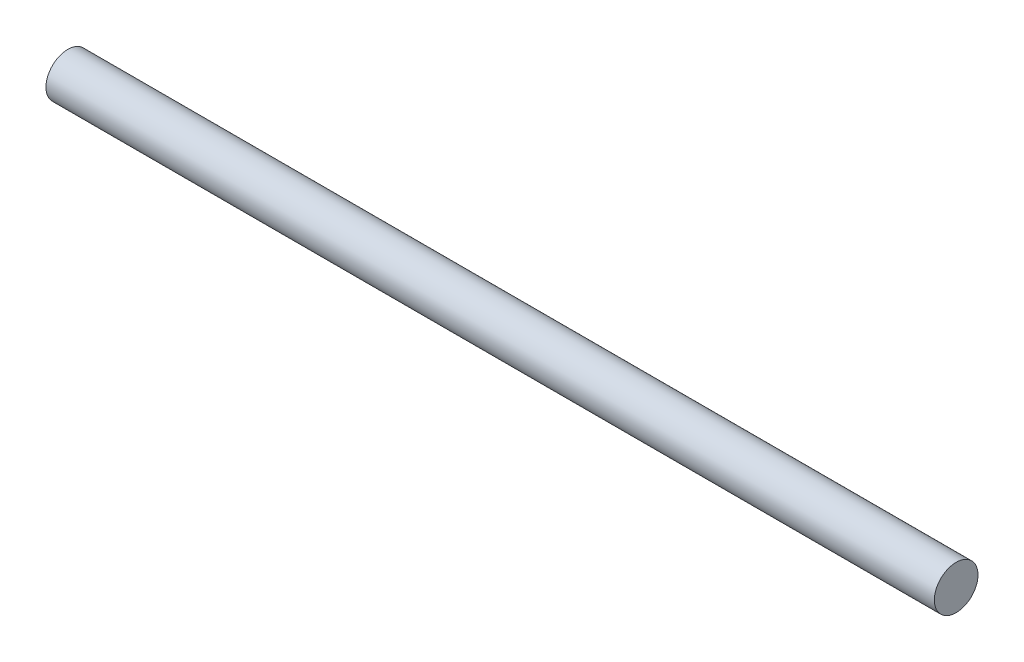
ISO-10303-21;
HEADER;
FILE_DESCRIPTION(('STEP AP214'),'2;1');
FILE_NAME('part.step','',(''),(''),'','','');
FILE_SCHEMA(('AUTOMOTIVE_DESIGN { 1 0 10303 214 1 1 1 1 }'));
ENDSEC;
DATA;
#1=APPLICATION_CONTEXT('core data for automotive mechanical design processes');
#2=APPLICATION_PROTOCOL_DEFINITION('international standard','automotive_design',2000,#1);
#3=PRODUCT_CONTEXT('',#1,'mechanical');
#4=PRODUCT('Part','Part','',(#3));
#5=PRODUCT_RELATED_PRODUCT_CATEGORY('part','',(#4));
#6=PRODUCT_DEFINITION_FORMATION('','',#4);
#7=PRODUCT_DEFINITION_CONTEXT('part definition',#1,'design');
#8=PRODUCT_DEFINITION('design','',#6,#7);
#9=PRODUCT_DEFINITION_SHAPE('','',#8);
#10=(LENGTH_UNIT() NAMED_UNIT(*) SI_UNIT(.MILLI.,.METRE.));
#11=(NAMED_UNIT(*) PLANE_ANGLE_UNIT() SI_UNIT($,.RADIAN.));
#12=(NAMED_UNIT(*) SI_UNIT($,.STERADIAN.) SOLID_ANGLE_UNIT());
#13=UNCERTAINTY_MEASURE_WITH_UNIT(LENGTH_MEASURE(1.E-05),#10,'distance_accuracy_value','');
#14=(GEOMETRIC_REPRESENTATION_CONTEXT(3) GLOBAL_UNCERTAINTY_ASSIGNED_CONTEXT((#13)) GLOBAL_UNIT_ASSIGNED_CONTEXT((#10,
#11,#12)) REPRESENTATION_CONTEXT('',''));
#15=CARTESIAN_POINT('',(0.,0.,0.));
#16=DIRECTION('',(0.,0.,1.));
#17=DIRECTION('',(1.,0.,0.));
#18=AXIS2_PLACEMENT_3D('',#15,#16,#17);
#19=CARTESIAN_POINT('',(-25.,0.,0.));
#20=DIRECTION('',(1.,0.,0.));
#21=DIRECTION('',(0.,0.,-1.));
#22=AXIS2_PLACEMENT_3D('',#19,#20,#21);
#23=CYLINDRICAL_SURFACE('',#22,1.22898101806641);
#24=CARTESIAN_POINT('',(-25.,0.,0.));
#25=DIRECTION('',(1.,0.,0.));
#26=DIRECTION('',(0.,0.,-1.));
#27=AXIS2_PLACEMENT_3D('',#24,#25,#26);
#28=CIRCLE('',#27,1.22898101806641);
#29=CARTESIAN_POINT('',(-25.,0.,-1.22898101806641));
#30=VERTEX_POINT('',#29);
#31=EDGE_CURVE('E10',#30,#30,#28,.T.);
#32=ORIENTED_EDGE('',*,*,#31,.T.);
#33=EDGE_LOOP('',(#32));
#34=FACE_BOUND('',#33,.T.);
#35=CARTESIAN_POINT('',(25.,0.,0.));
#36=DIRECTION('',(1.,0.,0.));
#37=DIRECTION('',(0.,0.,-1.));
#38=AXIS2_PLACEMENT_3D('',#35,#36,#37);
#39=CIRCLE('',#38,1.22898101806641);
#40=CARTESIAN_POINT('',(25.,0.,-1.22898101806641));
#41=VERTEX_POINT('',#40);
#42=EDGE_CURVE('E41',#41,#41,#39,.T.);
#43=ORIENTED_EDGE('',*,*,#42,.F.);
#44=EDGE_LOOP('',(#43));
#45=FACE_BOUND('',#44,.T.);
#46=ADVANCED_FACE('F35',(#34,#45),#23,.T.);
#47=CARTESIAN_POINT('',(-25.,0.,0.));
#48=DIRECTION('',(1.,0.,0.));
#49=DIRECTION('',(0.,0.,-1.));
#50=AXIS2_PLACEMENT_3D('',#47,#48,#49);
#51=PLANE('',#50);
#52=ORIENTED_EDGE('',*,*,#31,.F.);
#53=EDGE_LOOP('',(#52));
#54=FACE_BOUND('',#53,.T.);
#55=ADVANCED_FACE('F50',(#54),#51,.F.);
#56=CARTESIAN_POINT('',(25.,0.,0.));
#57=DIRECTION('',(1.,0.,0.));
#58=DIRECTION('',(0.,0.,-1.));
#59=AXIS2_PLACEMENT_3D('',#56,#57,#58);
#60=PLANE('',#59);
#61=ORIENTED_EDGE('',*,*,#42,.T.);
#62=EDGE_LOOP('',(#61));
#63=FACE_BOUND('',#62,.T.);
#64=ADVANCED_FACE('F47',(#63),#60,.T.);
#65=CLOSED_SHELL('',(#46,#55,#64));
#66=MANIFOLD_SOLID_BREP('B2',#65);
#67=ADVANCED_BREP_SHAPE_REPRESENTATION('',(#18,#66),#14);
#68=SHAPE_DEFINITION_REPRESENTATION(#9,#67);
ENDSEC;
END-ISO-10303-21;
